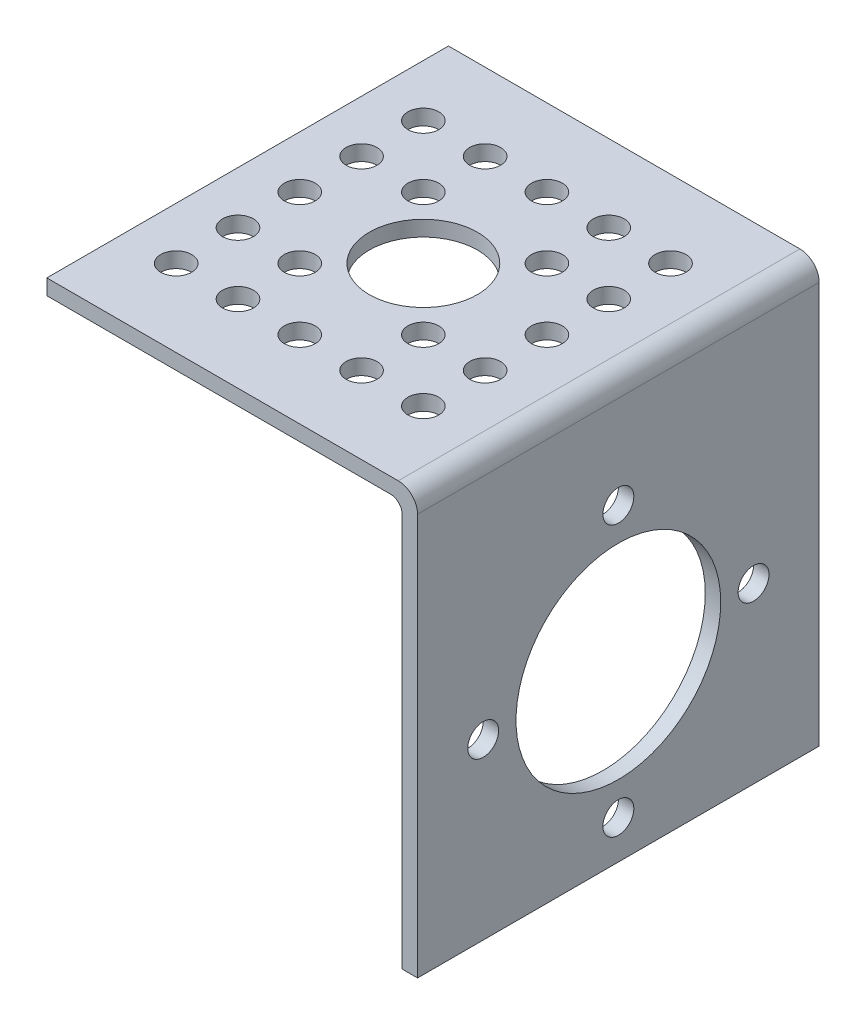
ISO-10303-21;
HEADER;
FILE_DESCRIPTION(('STEP AP214'),'2;1');
FILE_NAME('part.step','',(''),(''),'','','');
FILE_SCHEMA(('AUTOMOTIVE_DESIGN { 1 0 10303 214 1 1 1 1 }'));
ENDSEC;
DATA;
#1=APPLICATION_CONTEXT('core data for automotive mechanical design processes');
#2=APPLICATION_PROTOCOL_DEFINITION('international standard','automotive_design',2000,#1);
#3=PRODUCT_CONTEXT('',#1,'mechanical');
#4=PRODUCT('Part','Part','',(#3));
#5=PRODUCT_RELATED_PRODUCT_CATEGORY('part','',(#4));
#6=PRODUCT_DEFINITION_FORMATION('','',#4);
#7=PRODUCT_DEFINITION_CONTEXT('part definition',#1,'design');
#8=PRODUCT_DEFINITION('design','',#6,#7);
#9=PRODUCT_DEFINITION_SHAPE('','',#8);
#10=(LENGTH_UNIT() NAMED_UNIT(*) SI_UNIT(.MILLI.,.METRE.));
#11=(NAMED_UNIT(*) PLANE_ANGLE_UNIT() SI_UNIT($,.RADIAN.));
#12=(NAMED_UNIT(*) SI_UNIT($,.STERADIAN.) SOLID_ANGLE_UNIT());
#13=UNCERTAINTY_MEASURE_WITH_UNIT(LENGTH_MEASURE(1.E-05),#10,'distance_accuracy_value','');
#14=(GEOMETRIC_REPRESENTATION_CONTEXT(3) GLOBAL_UNCERTAINTY_ASSIGNED_CONTEXT((#13)) GLOBAL_UNIT_ASSIGNED_CONTEXT((#10,
#11,#12)) REPRESENTATION_CONTEXT('',''));
#15=CARTESIAN_POINT('',(0.,0.,0.));
#16=DIRECTION('',(0.,0.,1.));
#17=DIRECTION('',(1.,0.,0.));
#18=AXIS2_PLACEMENT_3D('',#15,#16,#17);
#19=CARTESIAN_POINT('',(2.,0.,0.));
#20=DIRECTION('',(-1.,0.,0.));
#21=DIRECTION('',(0.,0.,1.));
#22=AXIS2_PLACEMENT_3D('',#19,#20,#21);
#23=PLANE('',#22);
#24=DIRECTION('',(0.,1.,0.));
#25=VECTOR('',#24,1.);
#26=CARTESIAN_POINT('',(2.,30.,-26.));
#27=LINE('',#26,#25);
#28=CARTESIAN_POINT('',(2.,-22.5,-26.));
#29=VERTEX_POINT('',#28);
#30=CARTESIAN_POINT('',(2.,29.5,-26.));
#31=VERTEX_POINT('',#30);
#32=EDGE_CURVE('E198',#29,#31,#27,.T.);
#33=ORIENTED_EDGE('',*,*,#32,.T.);
#34=DIRECTION('',(0.,0.,1.));
#35=VECTOR('',#34,1.);
#36=CARTESIAN_POINT('',(2.,29.5,26.));
#37=LINE('',#36,#35);
#38=CARTESIAN_POINT('',(2.,29.5,26.));
#39=VERTEX_POINT('',#38);
#40=EDGE_CURVE('E229',#31,#39,#37,.T.);
#41=ORIENTED_EDGE('',*,*,#40,.T.);
#42=DIRECTION('',(0.,-1.,0.));
#43=VECTOR('',#42,1.);
#44=CARTESIAN_POINT('',(2.,30.,26.));
#45=LINE('',#44,#43);
#46=CARTESIAN_POINT('',(2.,-22.5,26.));
#47=VERTEX_POINT('',#46);
#48=EDGE_CURVE('E191',#39,#47,#45,.T.);
#49=ORIENTED_EDGE('',*,*,#48,.T.);
#50=DIRECTION('',(0.,0.,-1.));
#51=VECTOR('',#50,1.);
#52=CARTESIAN_POINT('',(2.,-22.5,26.));
#53=LINE('',#52,#51);
#54=EDGE_CURVE('E194',#47,#29,#53,.T.);
#55=ORIENTED_EDGE('',*,*,#54,.T.);
#56=EDGE_LOOP('',(#33,#41,#49,#55));
#57=FACE_BOUND('',#56,.T.);
#58=CARTESIAN_POINT('',(2.,17.5,0.));
#59=DIRECTION('',(1.,0.,0.));
#60=DIRECTION('',(0.,0.,-1.));
#61=AXIS2_PLACEMENT_3D('',#58,#59,#60);
#62=CIRCLE('',#61,2.);
#63=CARTESIAN_POINT('',(2.,17.5,-2.));
#64=VERTEX_POINT('',#63);
#65=EDGE_CURVE('E183',#64,#64,#62,.T.);
#66=ORIENTED_EDGE('',*,*,#65,.F.);
#67=EDGE_LOOP('',(#66));
#68=FACE_BOUND('',#67,.T.);
#69=CARTESIAN_POINT('',(2.,0.,0.));
#70=DIRECTION('',(1.,0.,0.));
#71=DIRECTION('',(0.,0.,-1.));
#72=AXIS2_PLACEMENT_3D('',#69,#70,#71);
#73=CIRCLE('',#72,13.25);
#74=CARTESIAN_POINT('',(2.,0.,-13.25));
#75=VERTEX_POINT('',#74);
#76=EDGE_CURVE('E175',#75,#75,#73,.T.);
#77=ORIENTED_EDGE('',*,*,#76,.F.);
#78=EDGE_LOOP('',(#77));
#79=FACE_BOUND('',#78,.T.);
#80=CARTESIAN_POINT('',(2.,0.,-17.5));
#81=DIRECTION('',(1.,0.,0.));
#82=DIRECTION('',(0.,0.,-1.));
#83=AXIS2_PLACEMENT_3D('',#80,#81,#82);
#84=CIRCLE('',#83,2.);
#85=CARTESIAN_POINT('',(2.,0.,-19.5));
#86=VERTEX_POINT('',#85);
#87=EDGE_CURVE('E167',#86,#86,#84,.T.);
#88=ORIENTED_EDGE('',*,*,#87,.F.);
#89=EDGE_LOOP('',(#88));
#90=FACE_BOUND('',#89,.T.);
#91=CARTESIAN_POINT('',(2.,-17.5,1.2220184685951E-13));
#92=DIRECTION('',(1.,0.,0.));
#93=DIRECTION('',(0.,0.,-1.));
#94=AXIS2_PLACEMENT_3D('',#91,#92,#93);
#95=CIRCLE('',#94,2.);
#96=CARTESIAN_POINT('',(2.,-17.5,-1.99999999999988));
#97=VERTEX_POINT('',#96);
#98=EDGE_CURVE('E159',#97,#97,#95,.T.);
#99=ORIENTED_EDGE('',*,*,#98,.F.);
#100=EDGE_LOOP('',(#99));
#101=FACE_BOUND('',#100,.T.);
#102=CARTESIAN_POINT('',(2.,1.83302770289264E-13,17.5));
#103=DIRECTION('',(1.,0.,0.));
#104=DIRECTION('',(0.,0.,-1.));
#105=AXIS2_PLACEMENT_3D('',#102,#103,#104);
#106=CIRCLE('',#105,2.);
#107=CARTESIAN_POINT('',(2.,1.83302770289264E-13,15.5));
#108=VERTEX_POINT('',#107);
#109=EDGE_CURVE('E151',#108,#108,#106,.T.);
#110=ORIENTED_EDGE('',*,*,#109,.F.);
#111=EDGE_LOOP('',(#110));
#112=FACE_BOUND('',#111,.T.);
#113=ADVANCED_FACE('F38',(#57,#68,#79,#90,#101,#112),#23,.F.);
#114=CARTESIAN_POINT('',(0.,0.,0.));
#115=DIRECTION('',(-1.,0.,0.));
#116=DIRECTION('',(0.,0.,1.));
#117=AXIS2_PLACEMENT_3D('',#114,#115,#116);
#118=PLANE('',#117);
#119=CARTESIAN_POINT('',(0.,-17.5,1.2220184685951E-13));
#120=DIRECTION('',(1.,0.,0.));
#121=DIRECTION('',(0.,0.,-1.));
#122=AXIS2_PLACEMENT_3D('',#119,#120,#121);
#123=CIRCLE('',#122,2.);
#124=CARTESIAN_POINT('',(0.,-17.5,-1.99999999999988));
#125=VERTEX_POINT('',#124);
#126=EDGE_CURVE('E155',#125,#125,#123,.T.);
#127=ORIENTED_EDGE('',*,*,#126,.T.);
#128=EDGE_LOOP('',(#127));
#129=FACE_BOUND('',#128,.T.);
#130=CARTESIAN_POINT('',(0.,0.,0.));
#131=DIRECTION('',(1.,0.,0.));
#132=DIRECTION('',(0.,0.,-1.));
#133=AXIS2_PLACEMENT_3D('',#130,#131,#132);
#134=CIRCLE('',#133,13.25);
#135=CARTESIAN_POINT('',(0.,0.,-13.25));
#136=VERTEX_POINT('',#135);
#137=EDGE_CURVE('E171',#136,#136,#134,.T.);
#138=ORIENTED_EDGE('',*,*,#137,.T.);
#139=EDGE_LOOP('',(#138));
#140=FACE_BOUND('',#139,.T.);
#141=DIRECTION('',(0.,-1.,0.));
#142=VECTOR('',#141,1.);
#143=CARTESIAN_POINT('',(0.,30.,26.));
#144=LINE('',#143,#142);
#145=CARTESIAN_POINT('',(0.,28.5,26.));
#146=VERTEX_POINT('',#145);
#147=CARTESIAN_POINT('',(0.,-22.5,26.));
#148=VERTEX_POINT('',#147);
#149=EDGE_CURVE('E187',#146,#148,#144,.T.);
#150=ORIENTED_EDGE('',*,*,#149,.F.);
#151=DIRECTION('',(0.,0.,1.));
#152=VECTOR('',#151,1.);
#153=CARTESIAN_POINT('',(0.,28.5,-26.));
#154=LINE('',#153,#152);
#155=CARTESIAN_POINT('',(0.,28.5,-26.));
#156=VERTEX_POINT('',#155);
#157=EDGE_CURVE('E220',#146,#156,#154,.F.);
#158=ORIENTED_EDGE('',*,*,#157,.T.);
#159=DIRECTION('',(0.,1.,0.));
#160=VECTOR('',#159,1.);
#161=CARTESIAN_POINT('',(0.,30.,-26.));
#162=LINE('',#161,#160);
#163=CARTESIAN_POINT('',(0.,-22.5,-26.));
#164=VERTEX_POINT('',#163);
#165=EDGE_CURVE('E195',#164,#156,#162,.T.);
#166=ORIENTED_EDGE('',*,*,#165,.F.);
#167=DIRECTION('',(0.,0.,-1.));
#168=VECTOR('',#167,1.);
#169=CARTESIAN_POINT('',(0.,-22.5,26.));
#170=LINE('',#169,#168);
#171=EDGE_CURVE('E205',#148,#164,#170,.T.);
#172=ORIENTED_EDGE('',*,*,#171,.F.);
#173=EDGE_LOOP('',(#150,#158,#166,#172));
#174=FACE_BOUND('',#173,.T.);
#175=CARTESIAN_POINT('',(0.,17.5,0.));
#176=DIRECTION('',(1.,0.,0.));
#177=DIRECTION('',(0.,0.,-1.));
#178=AXIS2_PLACEMENT_3D('',#175,#176,#177);
#179=CIRCLE('',#178,2.);
#180=CARTESIAN_POINT('',(0.,17.5,-2.));
#181=VERTEX_POINT('',#180);
#182=EDGE_CURVE('E179',#181,#181,#179,.T.);
#183=ORIENTED_EDGE('',*,*,#182,.T.);
#184=EDGE_LOOP('',(#183));
#185=FACE_BOUND('',#184,.T.);
#186=CARTESIAN_POINT('',(0.,0.,-17.5));
#187=DIRECTION('',(1.,0.,0.));
#188=DIRECTION('',(0.,0.,-1.));
#189=AXIS2_PLACEMENT_3D('',#186,#187,#188);
#190=CIRCLE('',#189,2.);
#191=CARTESIAN_POINT('',(0.,0.,-19.5));
#192=VERTEX_POINT('',#191);
#193=EDGE_CURVE('E163',#192,#192,#190,.T.);
#194=ORIENTED_EDGE('',*,*,#193,.T.);
#195=EDGE_LOOP('',(#194));
#196=FACE_BOUND('',#195,.T.);
#197=CARTESIAN_POINT('',(0.,1.83302770289264E-13,17.5));
#198=DIRECTION('',(1.,0.,0.));
#199=DIRECTION('',(0.,0.,-1.));
#200=AXIS2_PLACEMENT_3D('',#197,#198,#199);
#201=CIRCLE('',#200,2.);
#202=CARTESIAN_POINT('',(0.,1.83302770289264E-13,15.5));
#203=VERTEX_POINT('',#202);
#204=EDGE_CURVE('E145',#203,#203,#201,.T.);
#205=ORIENTED_EDGE('',*,*,#204,.T.);
#206=EDGE_LOOP('',(#205));
#207=FACE_BOUND('',#206,.T.);
#208=ADVANCED_FACE('F515',(#129,#140,#174,#185,#196,#207),#118,.T.);
#209=CARTESIAN_POINT('',(2.,30.,26.));
#210=DIRECTION('',(0.,0.,-1.));
#211=DIRECTION('',(0.,1.,0.));
#212=AXIS2_PLACEMENT_3D('',#209,#210,#211);
#213=PLANE('',#212);
#214=ORIENTED_EDGE('',*,*,#48,.F.);
#215=CARTESIAN_POINT('',(-0.5,29.5,26.));
#216=DIRECTION('',(0.,0.,-1.));
#217=DIRECTION('',(0.,1.,0.));
#218=AXIS2_PLACEMENT_3D('',#215,#216,#217);
#219=CIRCLE('',#218,2.5);
#220=CARTESIAN_POINT('',(-0.5,32.,26.));
#221=VERTEX_POINT('',#220);
#222=EDGE_CURVE('E63',#39,#221,#219,.F.);
#223=ORIENTED_EDGE('',*,*,#222,.T.);
#224=DIRECTION('',(1.,0.,0.));
#225=VECTOR('',#224,1.);
#226=CARTESIAN_POINT('',(-46.,32.,26.));
#227=LINE('',#226,#225);
#228=CARTESIAN_POINT('',(-46.,32.,26.));
#229=VERTEX_POINT('',#228);
#230=EDGE_CURVE('E129',#229,#221,#227,.T.);
#231=ORIENTED_EDGE('',*,*,#230,.F.);
#232=DIRECTION('',(0.,-1.,0.));
#233=VECTOR('',#232,1.);
#234=CARTESIAN_POINT('',(-46.,32.,26.));
#235=LINE('',#234,#233);
#236=CARTESIAN_POINT('',(-46.,30.,26.));
#237=VERTEX_POINT('',#236);
#238=EDGE_CURVE('E122',#229,#237,#235,.T.);
#239=ORIENTED_EDGE('',*,*,#238,.T.);
#240=DIRECTION('',(1.,0.,0.));
#241=VECTOR('',#240,1.);
#242=CARTESIAN_POINT('',(-46.,30.,26.));
#243=LINE('',#242,#241);
#244=CARTESIAN_POINT('',(-1.5,30.,26.));
#245=VERTEX_POINT('',#244);
#246=EDGE_CURVE('E105',#237,#245,#243,.T.);
#247=ORIENTED_EDGE('',*,*,#246,.T.);
#248=CARTESIAN_POINT('',(-1.5,28.5,26.));
#249=DIRECTION('',(0.,0.,-1.));
#250=DIRECTION('',(0.,1.,0.));
#251=AXIS2_PLACEMENT_3D('',#248,#249,#250);
#252=CIRCLE('',#251,1.5);
#253=EDGE_CURVE('E223',#245,#146,#252,.T.);
#254=ORIENTED_EDGE('',*,*,#253,.T.);
#255=ORIENTED_EDGE('',*,*,#149,.T.);
#256=DIRECTION('',(-1.,0.,0.));
#257=VECTOR('',#256,1.);
#258=CARTESIAN_POINT('',(2.,-22.5,26.));
#259=LINE('',#258,#257);
#260=EDGE_CURVE('E214',#47,#148,#259,.T.);
#261=ORIENTED_EDGE('',*,*,#260,.F.);
#262=EDGE_LOOP('',(#214,#223,#231,#239,#247,#254,#255,#261));
#263=FACE_BOUND('',#262,.T.);
#264=ADVANCED_FACE('F128',(#263),#213,.F.);
#265=CARTESIAN_POINT('',(2.,-22.5,26.));
#266=DIRECTION('',(0.,1.,0.));
#267=DIRECTION('',(0.,0.,1.));
#268=AXIS2_PLACEMENT_3D('',#265,#266,#267);
#269=PLANE('',#268);
#270=ORIENTED_EDGE('',*,*,#171,.T.);
#271=DIRECTION('',(-1.,0.,0.));
#272=VECTOR('',#271,1.);
#273=CARTESIAN_POINT('',(2.,-22.5,-26.));
#274=LINE('',#273,#272);
#275=EDGE_CURVE('E202',#29,#164,#274,.T.);
#276=ORIENTED_EDGE('',*,*,#275,.F.);
#277=ORIENTED_EDGE('',*,*,#54,.F.);
#278=ORIENTED_EDGE('',*,*,#260,.T.);
#279=EDGE_LOOP('',(#270,#276,#277,#278));
#280=FACE_BOUND('',#279,.T.);
#281=ADVANCED_FACE('F509',(#280),#269,.F.);
#282=CARTESIAN_POINT('',(2.,30.,-26.));
#283=DIRECTION('',(0.,0.,1.));
#284=DIRECTION('',(0.,-1.,0.));
#285=AXIS2_PLACEMENT_3D('',#282,#283,#284);
#286=PLANE('',#285);
#287=DIRECTION('',(1.,0.,0.));
#288=VECTOR('',#287,1.);
#289=CARTESIAN_POINT('',(-46.,32.,-26.));
#290=LINE('',#289,#288);
#291=CARTESIAN_POINT('',(-46.,32.,-26.));
#292=VERTEX_POINT('',#291);
#293=CARTESIAN_POINT('',(-0.5,32.,-26.));
#294=VERTEX_POINT('',#293);
#295=EDGE_CURVE('E146',#292,#294,#290,.T.);
#296=ORIENTED_EDGE('',*,*,#295,.T.);
#297=CARTESIAN_POINT('',(-0.5,29.5,-26.));
#298=DIRECTION('',(0.,0.,1.));
#299=DIRECTION('',(0.,-1.,0.));
#300=AXIS2_PLACEMENT_3D('',#297,#298,#299);
#301=CIRCLE('',#300,2.5);
#302=EDGE_CURVE('E11',#294,#31,#301,.F.);
#303=ORIENTED_EDGE('',*,*,#302,.T.);
#304=ORIENTED_EDGE('',*,*,#32,.F.);
#305=ORIENTED_EDGE('',*,*,#275,.T.);
#306=ORIENTED_EDGE('',*,*,#165,.T.);
#307=CARTESIAN_POINT('',(-1.5,28.5,-26.));
#308=DIRECTION('',(0.,0.,1.));
#309=DIRECTION('',(0.,-1.,0.));
#310=AXIS2_PLACEMENT_3D('',#307,#308,#309);
#311=CIRCLE('',#310,1.5);
#312=CARTESIAN_POINT('',(-1.5,30.,-26.));
#313=VERTEX_POINT('',#312);
#314=EDGE_CURVE('E226',#156,#313,#311,.T.);
#315=ORIENTED_EDGE('',*,*,#314,.T.);
#316=DIRECTION('',(1.,0.,0.));
#317=VECTOR('',#316,1.);
#318=CARTESIAN_POINT('',(-46.,30.,-26.));
#319=LINE('',#318,#317);
#320=CARTESIAN_POINT('',(-46.,30.,-26.));
#321=VERTEX_POINT('',#320);
#322=EDGE_CURVE('E114',#321,#313,#319,.T.);
#323=ORIENTED_EDGE('',*,*,#322,.F.);
#324=DIRECTION('',(0.,1.,0.));
#325=VECTOR('',#324,1.);
#326=CARTESIAN_POINT('',(-46.,30.,-26.));
#327=LINE('',#326,#325);
#328=EDGE_CURVE('E125',#321,#292,#327,.T.);
#329=ORIENTED_EDGE('',*,*,#328,.T.);
#330=EDGE_LOOP('',(#296,#303,#304,#305,#306,#315,#323,#329));
#331=FACE_BOUND('',#330,.T.);
#332=ADVANCED_FACE('F502',(#331),#286,.F.);
#333=CARTESIAN_POINT('',(2.,17.5,0.));
#334=DIRECTION('',(-1.,0.,0.));
#335=DIRECTION('',(0.,0.,1.));
#336=AXIS2_PLACEMENT_3D('',#333,#334,#335);
#337=CYLINDRICAL_SURFACE('',#336,2.);
#338=ORIENTED_EDGE('',*,*,#65,.T.);
#339=EDGE_LOOP('',(#338));
#340=FACE_BOUND('',#339,.T.);
#341=ORIENTED_EDGE('',*,*,#182,.F.);
#342=EDGE_LOOP('',(#341));
#343=FACE_BOUND('',#342,.T.);
#344=ADVANCED_FACE('F535',(#340,#343),#337,.F.);
#345=CARTESIAN_POINT('',(2.,0.,0.));
#346=DIRECTION('',(-1.,0.,0.));
#347=DIRECTION('',(0.,0.,1.));
#348=AXIS2_PLACEMENT_3D('',#345,#346,#347);
#349=CYLINDRICAL_SURFACE('',#348,13.25);
#350=ORIENTED_EDGE('',*,*,#76,.T.);
#351=EDGE_LOOP('',(#350));
#352=FACE_BOUND('',#351,.T.);
#353=ORIENTED_EDGE('',*,*,#137,.F.);
#354=EDGE_LOOP('',(#353));
#355=FACE_BOUND('',#354,.T.);
#356=ADVANCED_FACE('F561',(#352,#355),#349,.F.);
#357=CARTESIAN_POINT('',(2.,0.,-17.5));
#358=DIRECTION('',(-1.,0.,0.));
#359=DIRECTION('',(0.,0.,1.));
#360=AXIS2_PLACEMENT_3D('',#357,#358,#359);
#361=CYLINDRICAL_SURFACE('',#360,2.);
#362=ORIENTED_EDGE('',*,*,#87,.T.);
#363=EDGE_LOOP('',(#362));
#364=FACE_BOUND('',#363,.T.);
#365=ORIENTED_EDGE('',*,*,#193,.F.);
#366=EDGE_LOOP('',(#365));
#367=FACE_BOUND('',#366,.T.);
#368=ADVANCED_FACE('F568',(#364,#367),#361,.F.);
#369=CARTESIAN_POINT('',(2.,-17.5,1.2220184685951E-13));
#370=DIRECTION('',(-1.,0.,0.));
#371=DIRECTION('',(0.,0.,1.));
#372=AXIS2_PLACEMENT_3D('',#369,#370,#371);
#373=CYLINDRICAL_SURFACE('',#372,2.);
#374=ORIENTED_EDGE('',*,*,#98,.T.);
#375=EDGE_LOOP('',(#374));
#376=FACE_BOUND('',#375,.T.);
#377=ORIENTED_EDGE('',*,*,#126,.F.);
#378=EDGE_LOOP('',(#377));
#379=FACE_BOUND('',#378,.T.);
#380=ADVANCED_FACE('F575',(#376,#379),#373,.F.);
#381=CARTESIAN_POINT('',(2.,1.83302770289264E-13,17.5));
#382=DIRECTION('',(-1.,0.,0.));
#383=DIRECTION('',(0.,0.,1.));
#384=AXIS2_PLACEMENT_3D('',#381,#382,#383);
#385=CYLINDRICAL_SURFACE('',#384,2.);
#386=ORIENTED_EDGE('',*,*,#109,.T.);
#387=EDGE_LOOP('',(#386));
#388=FACE_BOUND('',#387,.T.);
#389=ORIENTED_EDGE('',*,*,#204,.F.);
#390=EDGE_LOOP('',(#389));
#391=FACE_BOUND('',#390,.T.);
#392=ADVANCED_FACE('F462',(#388,#391),#385,.F.);
#393=CARTESIAN_POINT('',(-46.,32.,-26.));
#394=DIRECTION('',(0.,1.,0.));
#395=DIRECTION('',(0.,0.,1.));
#396=AXIS2_PLACEMENT_3D('',#393,#394,#395);
#397=PLANE('',#396);
#398=CARTESIAN_POINT('',(-7.25,32.,-16.));
#399=DIRECTION('',(0.,1.,0.));
#400=DIRECTION('',(0.,0.,1.));
#401=AXIS2_PLACEMENT_3D('',#398,#399,#400);
#402=CIRCLE('',#401,2.);
#403=CARTESIAN_POINT('',(-7.25,32.,-14.));
#404=VERTEX_POINT('',#403);
#405=EDGE_CURVE('E393',#404,#404,#402,.T.);
#406=ORIENTED_EDGE('',*,*,#405,.F.);
#407=EDGE_LOOP('',(#406));
#408=FACE_BOUND('',#407,.T.);
#409=CARTESIAN_POINT('',(-31.2499999999999,32.,-8.));
#410=DIRECTION('',(0.,1.,0.));
#411=DIRECTION('',(0.,0.,1.));
#412=AXIS2_PLACEMENT_3D('',#409,#410,#411);
#413=CIRCLE('',#412,2.);
#414=CARTESIAN_POINT('',(-31.2499999999999,32.,-5.99999999999999));
#415=VERTEX_POINT('',#414);
#416=EDGE_CURVE('E383',#415,#415,#413,.T.);
#417=ORIENTED_EDGE('',*,*,#416,.F.);
#418=EDGE_LOOP('',(#417));
#419=FACE_BOUND('',#418,.T.);
#420=CARTESIAN_POINT('',(-15.2499999999999,32.,-8.));
#421=DIRECTION('',(0.,1.,0.));
#422=DIRECTION('',(0.,0.,1.));
#423=AXIS2_PLACEMENT_3D('',#420,#421,#422);
#424=CIRCLE('',#423,2.);
#425=CARTESIAN_POINT('',(-15.2499999999999,32.,-5.99999999999999));
#426=VERTEX_POINT('',#425);
#427=EDGE_CURVE('E446',#426,#426,#424,.T.);
#428=ORIENTED_EDGE('',*,*,#427,.F.);
#429=EDGE_LOOP('',(#428));
#430=FACE_BOUND('',#429,.T.);
#431=CARTESIAN_POINT('',(-7.24999999999992,32.,-8.));
#432=DIRECTION('',(0.,1.,0.));
#433=DIRECTION('',(0.,0.,1.));
#434=AXIS2_PLACEMENT_3D('',#431,#432,#433);
#435=CIRCLE('',#434,2.);
#436=CARTESIAN_POINT('',(-7.24999999999992,32.,-5.99999999999999));
#437=VERTEX_POINT('',#436);
#438=EDGE_CURVE('E408',#437,#437,#435,.T.);
#439=ORIENTED_EDGE('',*,*,#438,.F.);
#440=EDGE_LOOP('',(#439));
#441=FACE_BOUND('',#440,.T.);
#442=CARTESIAN_POINT('',(-15.25,32.,-16.));
#443=DIRECTION('',(0.,1.,0.));
#444=DIRECTION('',(0.,0.,1.));
#445=AXIS2_PLACEMENT_3D('',#442,#443,#444);
#446=CIRCLE('',#445,2.);
#447=CARTESIAN_POINT('',(-15.25,32.,-14.));
#448=VERTEX_POINT('',#447);
#449=EDGE_CURVE('E389',#448,#448,#446,.T.);
#450=ORIENTED_EDGE('',*,*,#449,.F.);
#451=EDGE_LOOP('',(#450));
#452=FACE_BOUND('',#451,.T.);
#453=CARTESIAN_POINT('',(-23.25,32.,-16.));
#454=DIRECTION('',(0.,1.,0.));
#455=DIRECTION('',(0.,0.,1.));
#456=AXIS2_PLACEMENT_3D('',#453,#454,#455);
#457=CIRCLE('',#456,2.);
#458=CARTESIAN_POINT('',(-23.25,32.,-14.));
#459=VERTEX_POINT('',#458);
#460=EDGE_CURVE('E380',#459,#459,#457,.T.);
#461=ORIENTED_EDGE('',*,*,#460,.F.);
#462=EDGE_LOOP('',(#461));
#463=FACE_BOUND('',#462,.T.);
#464=CARTESIAN_POINT('',(-31.25,32.,-16.));
#465=DIRECTION('',(0.,1.,0.));
#466=DIRECTION('',(0.,0.,1.));
#467=AXIS2_PLACEMENT_3D('',#464,#465,#466);
#468=CIRCLE('',#467,2.);
#469=CARTESIAN_POINT('',(-31.25,32.,-14.));
#470=VERTEX_POINT('',#469);
#471=EDGE_CURVE('E374',#470,#470,#468,.T.);
#472=ORIENTED_EDGE('',*,*,#471,.F.);
#473=EDGE_LOOP('',(#472));
#474=FACE_BOUND('',#473,.T.);
#475=CARTESIAN_POINT('',(-39.25,32.,-16.));
#476=DIRECTION('',(0.,1.,0.));
#477=DIRECTION('',(0.,0.,1.));
#478=AXIS2_PLACEMENT_3D('',#475,#476,#477);
#479=CIRCLE('',#478,2.);
#480=CARTESIAN_POINT('',(-39.25,32.,-14.));
#481=VERTEX_POINT('',#480);
#482=EDGE_CURVE('E371',#481,#481,#479,.T.);
#483=ORIENTED_EDGE('',*,*,#482,.F.);
#484=EDGE_LOOP('',(#483));
#485=FACE_BOUND('',#484,.T.);
#486=CARTESIAN_POINT('',(-7.24999999999975,32.,8.));
#487=DIRECTION('',(0.,1.,0.));
#488=DIRECTION('',(0.,0.,1.));
#489=AXIS2_PLACEMENT_3D('',#486,#487,#488);
#490=CIRCLE('',#489,2.);
#491=CARTESIAN_POINT('',(-7.24999999999975,32.,10.));
#492=VERTEX_POINT('',#491);
#493=EDGE_CURVE('E399',#492,#492,#490,.T.);
#494=ORIENTED_EDGE('',*,*,#493,.F.);
#495=EDGE_LOOP('',(#494));
#496=FACE_BOUND('',#495,.T.);
#497=CARTESIAN_POINT('',(-15.2499999999997,32.,8.));
#498=DIRECTION('',(0.,1.,0.));
#499=DIRECTION('',(0.,0.,1.));
#500=AXIS2_PLACEMENT_3D('',#497,#498,#499);
#501=CIRCLE('',#500,2.);
#502=CARTESIAN_POINT('',(-15.2499999999997,32.,10.));
#503=VERTEX_POINT('',#502);
#504=EDGE_CURVE('E394',#503,#503,#501,.T.);
#505=ORIENTED_EDGE('',*,*,#504,.F.);
#506=EDGE_LOOP('',(#505));
#507=FACE_BOUND('',#506,.T.);
#508=CARTESIAN_POINT('',(-31.2499999999998,32.,8.));
#509=DIRECTION('',(0.,1.,0.));
#510=DIRECTION('',(0.,0.,1.));
#511=AXIS2_PLACEMENT_3D('',#508,#509,#510);
#512=CIRCLE('',#511,2.);
#513=CARTESIAN_POINT('',(-31.2499999999998,32.,10.));
#514=VERTEX_POINT('',#513);
#515=EDGE_CURVE('E398',#514,#514,#512,.T.);
#516=ORIENTED_EDGE('',*,*,#515,.F.);
#517=EDGE_LOOP('',(#516));
#518=FACE_BOUND('',#517,.T.);
#519=CARTESIAN_POINT('',(-7.24999999999983,32.,0.));
#520=DIRECTION('',(0.,1.,0.));
#521=DIRECTION('',(0.,0.,1.));
#522=AXIS2_PLACEMENT_3D('',#519,#520,#521);
#523=CIRCLE('',#522,2.);
#524=CARTESIAN_POINT('',(-7.24999999999983,32.,2.00000000000001));
#525=VERTEX_POINT('',#524);
#526=EDGE_CURVE('E404',#525,#525,#523,.T.);
#527=ORIENTED_EDGE('',*,*,#526,.F.);
#528=EDGE_LOOP('',(#527));
#529=FACE_BOUND('',#528,.T.);
#530=CARTESIAN_POINT('',(-31.2499999999997,32.,16.));
#531=DIRECTION('',(0.,1.,0.));
#532=DIRECTION('',(0.,0.,1.));
#533=AXIS2_PLACEMENT_3D('',#530,#531,#532);
#534=CIRCLE('',#533,2.);
#535=CARTESIAN_POINT('',(-31.2499999999997,32.,18.));
#536=VERTEX_POINT('',#535);
#537=EDGE_CURVE('E403',#536,#536,#534,.T.);
#538=ORIENTED_EDGE('',*,*,#537,.F.);
#539=EDGE_LOOP('',(#538));
#540=FACE_BOUND('',#539,.T.);
#541=CARTESIAN_POINT('',(-23.2499999999997,32.,16.));
#542=DIRECTION('',(0.,1.,0.));
#543=DIRECTION('',(0.,0.,1.));
#544=AXIS2_PLACEMENT_3D('',#541,#542,#543);
#545=CIRCLE('',#544,2.);
#546=CARTESIAN_POINT('',(-23.2499999999997,32.,18.));
#547=VERTEX_POINT('',#546);
#548=EDGE_CURVE('E415',#547,#547,#545,.T.);
#549=ORIENTED_EDGE('',*,*,#548,.F.);
#550=EDGE_LOOP('',(#549));
#551=FACE_BOUND('',#550,.T.);
#552=CARTESIAN_POINT('',(-15.2499999999997,32.,16.));
#553=DIRECTION('',(0.,1.,0.));
#554=DIRECTION('',(0.,0.,1.));
#555=AXIS2_PLACEMENT_3D('',#552,#553,#554);
#556=CIRCLE('',#555,2.);
#557=CARTESIAN_POINT('',(-15.2499999999997,32.,18.));
#558=VERTEX_POINT('',#557);
#559=EDGE_CURVE('E419',#558,#558,#556,.T.);
#560=ORIENTED_EDGE('',*,*,#559,.F.);
#561=EDGE_LOOP('',(#560));
#562=FACE_BOUND('',#561,.T.);
#563=CARTESIAN_POINT('',(-7.24999999999967,32.,16.));
#564=DIRECTION('',(0.,1.,0.));
#565=DIRECTION('',(0.,0.,1.));
#566=AXIS2_PLACEMENT_3D('',#563,#564,#565);
#567=CIRCLE('',#566,2.);
#568=CARTESIAN_POINT('',(-7.24999999999967,32.,18.));
#569=VERTEX_POINT('',#568);
#570=EDGE_CURVE('E422',#569,#569,#567,.T.);
#571=ORIENTED_EDGE('',*,*,#570,.F.);
#572=EDGE_LOOP('',(#571));
#573=FACE_BOUND('',#572,.T.);
#574=CARTESIAN_POINT('',(-39.2499999999999,32.,-8.));
#575=DIRECTION('',(0.,1.,0.));
#576=DIRECTION('',(0.,0.,1.));
#577=AXIS2_PLACEMENT_3D('',#574,#575,#576);
#578=CIRCLE('',#577,2.);
#579=CARTESIAN_POINT('',(-39.2499999999999,32.,-5.99999999999999));
#580=VERTEX_POINT('',#579);
#581=EDGE_CURVE('E425',#580,#580,#578,.T.);
#582=ORIENTED_EDGE('',*,*,#581,.F.);
#583=EDGE_LOOP('',(#582));
#584=FACE_BOUND('',#583,.T.);
#585=CARTESIAN_POINT('',(-39.2499999999998,32.,0.));
#586=DIRECTION('',(0.,1.,0.));
#587=DIRECTION('',(0.,0.,1.));
#588=AXIS2_PLACEMENT_3D('',#585,#586,#587);
#589=CIRCLE('',#588,2.);
#590=CARTESIAN_POINT('',(-39.2499999999998,32.,2.00000000000001));
#591=VERTEX_POINT('',#590);
#592=EDGE_CURVE('E430',#591,#591,#589,.T.);
#593=ORIENTED_EDGE('',*,*,#592,.F.);
#594=EDGE_LOOP('',(#593));
#595=FACE_BOUND('',#594,.T.);
#596=CARTESIAN_POINT('',(-39.2499999999998,32.,8.));
#597=DIRECTION('',(0.,1.,0.));
#598=DIRECTION('',(0.,0.,1.));
#599=AXIS2_PLACEMENT_3D('',#596,#597,#598);
#600=CIRCLE('',#599,2.);
#601=CARTESIAN_POINT('',(-39.2499999999998,32.,10.));
#602=VERTEX_POINT('',#601);
#603=EDGE_CURVE('E436',#602,#602,#600,.T.);
#604=ORIENTED_EDGE('',*,*,#603,.F.);
#605=EDGE_LOOP('',(#604));
#606=FACE_BOUND('',#605,.T.);
#607=CARTESIAN_POINT('',(-39.2499999999997,32.,16.));
#608=DIRECTION('',(0.,1.,0.));
#609=DIRECTION('',(0.,0.,1.));
#610=AXIS2_PLACEMENT_3D('',#607,#608,#609);
#611=CIRCLE('',#610,2.);
#612=CARTESIAN_POINT('',(-39.2499999999997,32.,18.));
#613=VERTEX_POINT('',#612);
#614=EDGE_CURVE('E442',#613,#613,#611,.T.);
#615=ORIENTED_EDGE('',*,*,#614,.F.);
#616=EDGE_LOOP('',(#615));
#617=FACE_BOUND('',#616,.T.);
#618=CARTESIAN_POINT('',(-23.25,32.,0.));
#619=DIRECTION('',(0.,1.,0.));
#620=DIRECTION('',(0.,0.,1.));
#621=AXIS2_PLACEMENT_3D('',#618,#619,#620);
#622=CIRCLE('',#621,7.);
#623=CARTESIAN_POINT('',(-23.25,32.,7.));
#624=VERTEX_POINT('',#623);
#625=EDGE_CURVE('E136',#624,#624,#622,.T.);
#626=ORIENTED_EDGE('',*,*,#625,.F.);
#627=EDGE_LOOP('',(#626));
#628=FACE_BOUND('',#627,.T.);
#629=ORIENTED_EDGE('',*,*,#230,.T.);
#630=DIRECTION('',(0.,0.,1.));
#631=VECTOR('',#630,1.);
#632=CARTESIAN_POINT('',(-0.5,32.,-26.));
#633=LINE('',#632,#631);
#634=EDGE_CURVE('E48',#221,#294,#633,.F.);
#635=ORIENTED_EDGE('',*,*,#634,.T.);
#636=ORIENTED_EDGE('',*,*,#295,.F.);
#637=DIRECTION('',(0.,0.,1.));
#638=VECTOR('',#637,1.);
#639=CARTESIAN_POINT('',(-46.,32.,-26.));
#640=LINE('',#639,#638);
#641=EDGE_CURVE('E115',#292,#229,#640,.T.);
#642=ORIENTED_EDGE('',*,*,#641,.T.);
#643=EDGE_LOOP('',(#629,#635,#636,#642));
#644=FACE_BOUND('',#643,.T.);
#645=ADVANCED_FACE('F321',(#408,#419,#430,#441,#452,#463,#474,#485,#496,#507,#518,#529,#540,
#551,#562,#573,#584,#595,#606,#617,#628,#644),#397,.T.);
#646=CARTESIAN_POINT('',(-46.,30.,26.));
#647=DIRECTION('',(0.,-1.,0.));
#648=DIRECTION('',(0.,0.,-1.));
#649=AXIS2_PLACEMENT_3D('',#646,#647,#648);
#650=PLANE('',#649);
#651=CARTESIAN_POINT('',(-7.25,30.,-16.));
#652=DIRECTION('',(0.,-1.,0.));
#653=DIRECTION('',(0.,0.,-1.));
#654=AXIS2_PLACEMENT_3D('',#651,#652,#653);
#655=CIRCLE('',#654,2.);
#656=CARTESIAN_POINT('',(-7.25,30.,-18.));
#657=VERTEX_POINT('',#656);
#658=EDGE_CURVE('E42',#657,#657,#655,.T.);
#659=ORIENTED_EDGE('',*,*,#658,.F.);
#660=EDGE_LOOP('',(#659));
#661=FACE_BOUND('',#660,.T.);
#662=CARTESIAN_POINT('',(-31.2499999999999,30.,-8.));
#663=DIRECTION('',(0.,-1.,0.));
#664=DIRECTION('',(0.,0.,-1.));
#665=AXIS2_PLACEMENT_3D('',#662,#663,#664);
#666=CIRCLE('',#665,2.);
#667=CARTESIAN_POINT('',(-31.2499999999999,30.,-10.));
#668=VERTEX_POINT('',#667);
#669=EDGE_CURVE('E134',#668,#668,#666,.T.);
#670=ORIENTED_EDGE('',*,*,#669,.F.);
#671=EDGE_LOOP('',(#670));
#672=FACE_BOUND('',#671,.T.);
#673=CARTESIAN_POINT('',(-15.2499999999999,30.,-8.));
#674=DIRECTION('',(0.,-1.,0.));
#675=DIRECTION('',(0.,0.,-1.));
#676=AXIS2_PLACEMENT_3D('',#673,#674,#675);
#677=CIRCLE('',#676,2.);
#678=CARTESIAN_POINT('',(-15.2499999999999,30.,-10.));
#679=VERTEX_POINT('',#678);
#680=EDGE_CURVE('E309',#679,#679,#677,.T.);
#681=ORIENTED_EDGE('',*,*,#680,.F.);
#682=EDGE_LOOP('',(#681));
#683=FACE_BOUND('',#682,.T.);
#684=CARTESIAN_POINT('',(-7.24999999999992,30.,-8.));
#685=DIRECTION('',(0.,-1.,0.));
#686=DIRECTION('',(0.,0.,-1.));
#687=AXIS2_PLACEMENT_3D('',#684,#685,#686);
#688=CIRCLE('',#687,2.);
#689=CARTESIAN_POINT('',(-7.24999999999992,30.,-10.));
#690=VERTEX_POINT('',#689);
#691=EDGE_CURVE('E305',#690,#690,#688,.T.);
#692=ORIENTED_EDGE('',*,*,#691,.F.);
#693=EDGE_LOOP('',(#692));
#694=FACE_BOUND('',#693,.T.);
#695=CARTESIAN_POINT('',(-15.25,30.,-16.));
#696=DIRECTION('',(0.,-1.,0.));
#697=DIRECTION('',(0.,0.,-1.));
#698=AXIS2_PLACEMENT_3D('',#695,#696,#697);
#699=CIRCLE('',#698,2.);
#700=CARTESIAN_POINT('',(-15.25,30.,-18.));
#701=VERTEX_POINT('',#700);
#702=EDGE_CURVE('E301',#701,#701,#699,.T.);
#703=ORIENTED_EDGE('',*,*,#702,.F.);
#704=EDGE_LOOP('',(#703));
#705=FACE_BOUND('',#704,.T.);
#706=CARTESIAN_POINT('',(-23.25,30.,-16.));
#707=DIRECTION('',(0.,-1.,0.));
#708=DIRECTION('',(0.,0.,-1.));
#709=AXIS2_PLACEMENT_3D('',#706,#707,#708);
#710=CIRCLE('',#709,2.);
#711=CARTESIAN_POINT('',(-23.25,30.,-18.));
#712=VERTEX_POINT('',#711);
#713=EDGE_CURVE('E297',#712,#712,#710,.T.);
#714=ORIENTED_EDGE('',*,*,#713,.F.);
#715=EDGE_LOOP('',(#714));
#716=FACE_BOUND('',#715,.T.);
#717=CARTESIAN_POINT('',(-31.25,30.,-16.));
#718=DIRECTION('',(0.,-1.,0.));
#719=DIRECTION('',(0.,0.,-1.));
#720=AXIS2_PLACEMENT_3D('',#717,#718,#719);
#721=CIRCLE('',#720,2.);
#722=CARTESIAN_POINT('',(-31.25,30.,-18.));
#723=VERTEX_POINT('',#722);
#724=EDGE_CURVE('E293',#723,#723,#721,.T.);
#725=ORIENTED_EDGE('',*,*,#724,.F.);
#726=EDGE_LOOP('',(#725));
#727=FACE_BOUND('',#726,.T.);
#728=CARTESIAN_POINT('',(-39.25,30.,-16.));
#729=DIRECTION('',(0.,-1.,0.));
#730=DIRECTION('',(0.,0.,-1.));
#731=AXIS2_PLACEMENT_3D('',#728,#729,#730);
#732=CIRCLE('',#731,2.);
#733=CARTESIAN_POINT('',(-39.25,30.,-18.));
#734=VERTEX_POINT('',#733);
#735=EDGE_CURVE('E289',#734,#734,#732,.T.);
#736=ORIENTED_EDGE('',*,*,#735,.F.);
#737=EDGE_LOOP('',(#736));
#738=FACE_BOUND('',#737,.T.);
#739=CARTESIAN_POINT('',(-7.24999999999975,30.,8.));
#740=DIRECTION('',(0.,-1.,0.));
#741=DIRECTION('',(0.,0.,-1.));
#742=AXIS2_PLACEMENT_3D('',#739,#740,#741);
#743=CIRCLE('',#742,2.);
#744=CARTESIAN_POINT('',(-7.24999999999975,30.,6.));
#745=VERTEX_POINT('',#744);
#746=EDGE_CURVE('E285',#745,#745,#743,.T.);
#747=ORIENTED_EDGE('',*,*,#746,.F.);
#748=EDGE_LOOP('',(#747));
#749=FACE_BOUND('',#748,.T.);
#750=CARTESIAN_POINT('',(-15.2499999999997,30.,8.));
#751=DIRECTION('',(0.,-1.,0.));
#752=DIRECTION('',(0.,0.,-1.));
#753=AXIS2_PLACEMENT_3D('',#750,#751,#752);
#754=CIRCLE('',#753,2.);
#755=CARTESIAN_POINT('',(-15.2499999999997,30.,6.));
#756=VERTEX_POINT('',#755);
#757=EDGE_CURVE('E281',#756,#756,#754,.T.);
#758=ORIENTED_EDGE('',*,*,#757,.F.);
#759=EDGE_LOOP('',(#758));
#760=FACE_BOUND('',#759,.T.);
#761=CARTESIAN_POINT('',(-31.2499999999998,30.,8.));
#762=DIRECTION('',(0.,-1.,0.));
#763=DIRECTION('',(0.,0.,-1.));
#764=AXIS2_PLACEMENT_3D('',#761,#762,#763);
#765=CIRCLE('',#764,2.);
#766=CARTESIAN_POINT('',(-31.2499999999998,30.,6.));
#767=VERTEX_POINT('',#766);
#768=EDGE_CURVE('E277',#767,#767,#765,.T.);
#769=ORIENTED_EDGE('',*,*,#768,.F.);
#770=EDGE_LOOP('',(#769));
#771=FACE_BOUND('',#770,.T.);
#772=CARTESIAN_POINT('',(-7.24999999999983,30.,0.));
#773=DIRECTION('',(0.,-1.,0.));
#774=DIRECTION('',(0.,0.,-1.));
#775=AXIS2_PLACEMENT_3D('',#772,#773,#774);
#776=CIRCLE('',#775,2.);
#777=CARTESIAN_POINT('',(-7.24999999999983,30.,-2.));
#778=VERTEX_POINT('',#777);
#779=EDGE_CURVE('E273',#778,#778,#776,.T.);
#780=ORIENTED_EDGE('',*,*,#779,.F.);
#781=EDGE_LOOP('',(#780));
#782=FACE_BOUND('',#781,.T.);
#783=CARTESIAN_POINT('',(-31.2499999999997,30.,16.));
#784=DIRECTION('',(0.,-1.,0.));
#785=DIRECTION('',(0.,0.,-1.));
#786=AXIS2_PLACEMENT_3D('',#783,#784,#785);
#787=CIRCLE('',#786,2.);
#788=CARTESIAN_POINT('',(-31.2499999999997,30.,14.));
#789=VERTEX_POINT('',#788);
#790=EDGE_CURVE('E269',#789,#789,#787,.T.);
#791=ORIENTED_EDGE('',*,*,#790,.F.);
#792=EDGE_LOOP('',(#791));
#793=FACE_BOUND('',#792,.T.);
#794=CARTESIAN_POINT('',(-23.2499999999997,30.,16.));
#795=DIRECTION('',(0.,-1.,0.));
#796=DIRECTION('',(0.,0.,-1.));
#797=AXIS2_PLACEMENT_3D('',#794,#795,#796);
#798=CIRCLE('',#797,2.);
#799=CARTESIAN_POINT('',(-23.2499999999997,30.,14.));
#800=VERTEX_POINT('',#799);
#801=EDGE_CURVE('E265',#800,#800,#798,.T.);
#802=ORIENTED_EDGE('',*,*,#801,.F.);
#803=EDGE_LOOP('',(#802));
#804=FACE_BOUND('',#803,.T.);
#805=CARTESIAN_POINT('',(-15.2499999999997,30.,16.));
#806=DIRECTION('',(0.,-1.,0.));
#807=DIRECTION('',(0.,0.,-1.));
#808=AXIS2_PLACEMENT_3D('',#805,#806,#807);
#809=CIRCLE('',#808,2.);
#810=CARTESIAN_POINT('',(-15.2499999999997,30.,14.));
#811=VERTEX_POINT('',#810);
#812=EDGE_CURVE('E261',#811,#811,#809,.T.);
#813=ORIENTED_EDGE('',*,*,#812,.F.);
#814=EDGE_LOOP('',(#813));
#815=FACE_BOUND('',#814,.T.);
#816=CARTESIAN_POINT('',(-7.24999999999967,30.,16.));
#817=DIRECTION('',(0.,-1.,0.));
#818=DIRECTION('',(0.,0.,-1.));
#819=AXIS2_PLACEMENT_3D('',#816,#817,#818);
#820=CIRCLE('',#819,2.);
#821=CARTESIAN_POINT('',(-7.24999999999967,30.,14.));
#822=VERTEX_POINT('',#821);
#823=EDGE_CURVE('E257',#822,#822,#820,.T.);
#824=ORIENTED_EDGE('',*,*,#823,.F.);
#825=EDGE_LOOP('',(#824));
#826=FACE_BOUND('',#825,.T.);
#827=CARTESIAN_POINT('',(-39.2499999999999,30.,-8.));
#828=DIRECTION('',(0.,-1.,0.));
#829=DIRECTION('',(0.,0.,-1.));
#830=AXIS2_PLACEMENT_3D('',#827,#828,#829);
#831=CIRCLE('',#830,2.);
#832=CARTESIAN_POINT('',(-39.2499999999999,30.,-10.));
#833=VERTEX_POINT('',#832);
#834=EDGE_CURVE('E253',#833,#833,#831,.T.);
#835=ORIENTED_EDGE('',*,*,#834,.F.);
#836=EDGE_LOOP('',(#835));
#837=FACE_BOUND('',#836,.T.);
#838=CARTESIAN_POINT('',(-39.2499999999998,30.,0.));
#839=DIRECTION('',(0.,-1.,0.));
#840=DIRECTION('',(0.,0.,-1.));
#841=AXIS2_PLACEMENT_3D('',#838,#839,#840);
#842=CIRCLE('',#841,2.);
#843=CARTESIAN_POINT('',(-39.2499999999998,30.,-2.));
#844=VERTEX_POINT('',#843);
#845=EDGE_CURVE('E249',#844,#844,#842,.T.);
#846=ORIENTED_EDGE('',*,*,#845,.F.);
#847=EDGE_LOOP('',(#846));
#848=FACE_BOUND('',#847,.T.);
#849=CARTESIAN_POINT('',(-39.2499999999998,30.,8.));
#850=DIRECTION('',(0.,-1.,0.));
#851=DIRECTION('',(0.,0.,-1.));
#852=AXIS2_PLACEMENT_3D('',#849,#850,#851);
#853=CIRCLE('',#852,2.);
#854=CARTESIAN_POINT('',(-39.2499999999998,30.,6.));
#855=VERTEX_POINT('',#854);
#856=EDGE_CURVE('E245',#855,#855,#853,.T.);
#857=ORIENTED_EDGE('',*,*,#856,.F.);
#858=EDGE_LOOP('',(#857));
#859=FACE_BOUND('',#858,.T.);
#860=CARTESIAN_POINT('',(-39.2499999999997,30.,16.));
#861=DIRECTION('',(0.,-1.,0.));
#862=DIRECTION('',(0.,0.,-1.));
#863=AXIS2_PLACEMENT_3D('',#860,#861,#862);
#864=CIRCLE('',#863,2.);
#865=CARTESIAN_POINT('',(-39.2499999999997,30.,14.));
#866=VERTEX_POINT('',#865);
#867=EDGE_CURVE('E241',#866,#866,#864,.T.);
#868=ORIENTED_EDGE('',*,*,#867,.F.);
#869=EDGE_LOOP('',(#868));
#870=FACE_BOUND('',#869,.T.);
#871=CARTESIAN_POINT('',(-23.25,30.,0.));
#872=DIRECTION('',(0.,-1.,0.));
#873=DIRECTION('',(0.,0.,-1.));
#874=AXIS2_PLACEMENT_3D('',#871,#872,#873);
#875=CIRCLE('',#874,7.);
#876=CARTESIAN_POINT('',(-23.25,30.,-7.));
#877=VERTEX_POINT('',#876);
#878=EDGE_CURVE('E237',#877,#877,#875,.T.);
#879=ORIENTED_EDGE('',*,*,#878,.F.);
#880=EDGE_LOOP('',(#879));
#881=FACE_BOUND('',#880,.T.);
#882=ORIENTED_EDGE('',*,*,#322,.T.);
#883=DIRECTION('',(0.,0.,1.));
#884=VECTOR('',#883,1.);
#885=CARTESIAN_POINT('',(-1.5,30.,26.));
#886=LINE('',#885,#884);
#887=EDGE_CURVE('E111',#313,#245,#886,.T.);
#888=ORIENTED_EDGE('',*,*,#887,.T.);
#889=ORIENTED_EDGE('',*,*,#246,.F.);
#890=DIRECTION('',(0.,0.,-1.));
#891=VECTOR('',#890,1.);
#892=CARTESIAN_POINT('',(-46.,30.,26.));
#893=LINE('',#892,#891);
#894=EDGE_CURVE('E109',#237,#321,#893,.T.);
#895=ORIENTED_EDGE('',*,*,#894,.T.);
#896=EDGE_LOOP('',(#882,#888,#889,#895));
#897=FACE_BOUND('',#896,.T.);
#898=ADVANCED_FACE('F108',(#661,#672,#683,#694,#705,#716,#727,#738,#749,#760,#771,#782,#793,
#804,#815,#826,#837,#848,#859,#870,#881,#897),#650,.T.);
#899=CARTESIAN_POINT('',(-46.,0.,0.));
#900=DIRECTION('',(1.,0.,0.));
#901=DIRECTION('',(0.,0.,-1.));
#902=AXIS2_PLACEMENT_3D('',#899,#900,#901);
#903=PLANE('',#902);
#904=ORIENTED_EDGE('',*,*,#238,.F.);
#905=ORIENTED_EDGE('',*,*,#641,.F.);
#906=ORIENTED_EDGE('',*,*,#328,.F.);
#907=ORIENTED_EDGE('',*,*,#894,.F.);
#908=EDGE_LOOP('',(#904,#905,#906,#907));
#909=FACE_BOUND('',#908,.T.);
#910=ADVANCED_FACE('F120',(#909),#903,.F.);
#911=CARTESIAN_POINT('',(-1.5,28.5,26.));
#912=DIRECTION('',(0.,0.,-1.));
#913=DIRECTION('',(-1.,0.,0.));
#914=AXIS2_PLACEMENT_3D('',#911,#912,#913);
#915=CYLINDRICAL_SURFACE('',#914,1.5);
#916=ORIENTED_EDGE('',*,*,#314,.F.);
#917=ORIENTED_EDGE('',*,*,#157,.F.);
#918=ORIENTED_EDGE('',*,*,#253,.F.);
#919=ORIENTED_EDGE('',*,*,#887,.F.);
#920=EDGE_LOOP('',(#916,#917,#918,#919));
#921=FACE_BOUND('',#920,.T.);
#922=ADVANCED_FACE('F519',(#921),#915,.F.);
#923=CARTESIAN_POINT('',(-0.5,29.5,0.));
#924=DIRECTION('',(0.,0.,-1.));
#925=DIRECTION('',(0.,1.,0.));
#926=AXIS2_PLACEMENT_3D('',#923,#924,#925);
#927=CYLINDRICAL_SURFACE('',#926,2.5);
#928=ORIENTED_EDGE('',*,*,#302,.F.);
#929=ORIENTED_EDGE('',*,*,#634,.F.);
#930=ORIENTED_EDGE('',*,*,#222,.F.);
#931=ORIENTED_EDGE('',*,*,#40,.F.);
#932=EDGE_LOOP('',(#928,#929,#930,#931));
#933=FACE_BOUND('',#932,.T.);
#934=ADVANCED_FACE('F40',(#933),#927,.T.);
#935=CARTESIAN_POINT('',(-23.25,-22.5,0.));
#936=DIRECTION('',(0.,1.,0.));
#937=DIRECTION('',(0.,0.,1.));
#938=AXIS2_PLACEMENT_3D('',#935,#936,#937);
#939=CYLINDRICAL_SURFACE('',#938,7.);
#940=ORIENTED_EDGE('',*,*,#878,.T.);
#941=EDGE_LOOP('',(#940));
#942=FACE_BOUND('',#941,.T.);
#943=ORIENTED_EDGE('',*,*,#625,.T.);
#944=EDGE_LOOP('',(#943));
#945=FACE_BOUND('',#944,.T.);
#946=ADVANCED_FACE('F362',(#942,#945),#939,.F.);
#947=CARTESIAN_POINT('',(-39.2499999999997,-22.5,16.));
#948=DIRECTION('',(0.,1.,0.));
#949=DIRECTION('',(0.,0.,1.));
#950=AXIS2_PLACEMENT_3D('',#947,#948,#949);
#951=CYLINDRICAL_SURFACE('',#950,2.);
#952=ORIENTED_EDGE('',*,*,#867,.T.);
#953=EDGE_LOOP('',(#952));
#954=FACE_BOUND('',#953,.T.);
#955=ORIENTED_EDGE('',*,*,#614,.T.);
#956=EDGE_LOOP('',(#955));
#957=FACE_BOUND('',#956,.T.);
#958=ADVANCED_FACE('F365',(#954,#957),#951,.F.);
#959=CARTESIAN_POINT('',(-39.2499999999998,-22.5,8.));
#960=DIRECTION('',(0.,1.,0.));
#961=DIRECTION('',(0.,0.,1.));
#962=AXIS2_PLACEMENT_3D('',#959,#960,#961);
#963=CYLINDRICAL_SURFACE('',#962,2.);
#964=ORIENTED_EDGE('',*,*,#856,.T.);
#965=EDGE_LOOP('',(#964));
#966=FACE_BOUND('',#965,.T.);
#967=ORIENTED_EDGE('',*,*,#603,.T.);
#968=EDGE_LOOP('',(#967));
#969=FACE_BOUND('',#968,.T.);
#970=ADVANCED_FACE('F663',(#966,#969),#963,.F.);
#971=CARTESIAN_POINT('',(-39.2499999999998,-22.5,0.));
#972=DIRECTION('',(0.,1.,0.));
#973=DIRECTION('',(0.,0.,1.));
#974=AXIS2_PLACEMENT_3D('',#971,#972,#973);
#975=CYLINDRICAL_SURFACE('',#974,2.);
#976=ORIENTED_EDGE('',*,*,#845,.T.);
#977=EDGE_LOOP('',(#976));
#978=FACE_BOUND('',#977,.T.);
#979=ORIENTED_EDGE('',*,*,#592,.T.);
#980=EDGE_LOOP('',(#979));
#981=FACE_BOUND('',#980,.T.);
#982=ADVANCED_FACE('F672',(#978,#981),#975,.F.);
#983=CARTESIAN_POINT('',(-39.2499999999999,-22.5,-8.));
#984=DIRECTION('',(0.,1.,0.));
#985=DIRECTION('',(0.,0.,1.));
#986=AXIS2_PLACEMENT_3D('',#983,#984,#985);
#987=CYLINDRICAL_SURFACE('',#986,2.);
#988=ORIENTED_EDGE('',*,*,#834,.T.);
#989=EDGE_LOOP('',(#988));
#990=FACE_BOUND('',#989,.T.);
#991=ORIENTED_EDGE('',*,*,#581,.T.);
#992=EDGE_LOOP('',(#991));
#993=FACE_BOUND('',#992,.T.);
#994=ADVANCED_FACE('F681',(#990,#993),#987,.F.);
#995=CARTESIAN_POINT('',(-7.24999999999967,-22.5,16.));
#996=DIRECTION('',(0.,1.,0.));
#997=DIRECTION('',(0.,0.,1.));
#998=AXIS2_PLACEMENT_3D('',#995,#996,#997);
#999=CYLINDRICAL_SURFACE('',#998,2.);
#1000=ORIENTED_EDGE('',*,*,#823,.T.);
#1001=EDGE_LOOP('',(#1000));
#1002=FACE_BOUND('',#1001,.T.);
#1003=ORIENTED_EDGE('',*,*,#570,.T.);
#1004=EDGE_LOOP('',(#1003));
#1005=FACE_BOUND('',#1004,.T.);
#1006=ADVANCED_FACE('F690',(#1002,#1005),#999,.F.);
#1007=CARTESIAN_POINT('',(-15.2499999999997,-22.5,16.));
#1008=DIRECTION('',(0.,1.,0.));
#1009=DIRECTION('',(0.,0.,1.));
#1010=AXIS2_PLACEMENT_3D('',#1007,#1008,#1009);
#1011=CYLINDRICAL_SURFACE('',#1010,2.);
#1012=ORIENTED_EDGE('',*,*,#812,.T.);
#1013=EDGE_LOOP('',(#1012));
#1014=FACE_BOUND('',#1013,.T.);
#1015=ORIENTED_EDGE('',*,*,#559,.T.);
#1016=EDGE_LOOP('',(#1015));
#1017=FACE_BOUND('',#1016,.T.);
#1018=ADVANCED_FACE('F699',(#1014,#1017),#1011,.F.);
#1019=CARTESIAN_POINT('',(-23.2499999999997,-22.5,16.));
#1020=DIRECTION('',(0.,1.,0.));
#1021=DIRECTION('',(0.,0.,1.));
#1022=AXIS2_PLACEMENT_3D('',#1019,#1020,#1021);
#1023=CYLINDRICAL_SURFACE('',#1022,2.);
#1024=ORIENTED_EDGE('',*,*,#801,.T.);
#1025=EDGE_LOOP('',(#1024));
#1026=FACE_BOUND('',#1025,.T.);
#1027=ORIENTED_EDGE('',*,*,#548,.T.);
#1028=EDGE_LOOP('',(#1027));
#1029=FACE_BOUND('',#1028,.T.);
#1030=ADVANCED_FACE('F708',(#1026,#1029),#1023,.F.);
#1031=CARTESIAN_POINT('',(-31.2499999999997,-22.5,16.));
#1032=DIRECTION('',(0.,1.,0.));
#1033=DIRECTION('',(0.,0.,1.));
#1034=AXIS2_PLACEMENT_3D('',#1031,#1032,#1033);
#1035=CYLINDRICAL_SURFACE('',#1034,2.);
#1036=ORIENTED_EDGE('',*,*,#790,.T.);
#1037=EDGE_LOOP('',(#1036));
#1038=FACE_BOUND('',#1037,.T.);
#1039=ORIENTED_EDGE('',*,*,#537,.T.);
#1040=EDGE_LOOP('',(#1039));
#1041=FACE_BOUND('',#1040,.T.);
#1042=ADVANCED_FACE('F717',(#1038,#1041),#1035,.F.);
#1043=CARTESIAN_POINT('',(-7.24999999999983,-22.5,0.));
#1044=DIRECTION('',(0.,1.,0.));
#1045=DIRECTION('',(0.,0.,1.));
#1046=AXIS2_PLACEMENT_3D('',#1043,#1044,#1045);
#1047=CYLINDRICAL_SURFACE('',#1046,2.);
#1048=ORIENTED_EDGE('',*,*,#779,.T.);
#1049=EDGE_LOOP('',(#1048));
#1050=FACE_BOUND('',#1049,.T.);
#1051=ORIENTED_EDGE('',*,*,#526,.T.);
#1052=EDGE_LOOP('',(#1051));
#1053=FACE_BOUND('',#1052,.T.);
#1054=ADVANCED_FACE('F726',(#1050,#1053),#1047,.F.);
#1055=CARTESIAN_POINT('',(-31.2499999999998,-22.5,8.));
#1056=DIRECTION('',(0.,1.,0.));
#1057=DIRECTION('',(0.,0.,1.));
#1058=AXIS2_PLACEMENT_3D('',#1055,#1056,#1057);
#1059=CYLINDRICAL_SURFACE('',#1058,2.);
#1060=ORIENTED_EDGE('',*,*,#768,.T.);
#1061=EDGE_LOOP('',(#1060));
#1062=FACE_BOUND('',#1061,.T.);
#1063=ORIENTED_EDGE('',*,*,#515,.T.);
#1064=EDGE_LOOP('',(#1063));
#1065=FACE_BOUND('',#1064,.T.);
#1066=ADVANCED_FACE('F735',(#1062,#1065),#1059,.F.);
#1067=CARTESIAN_POINT('',(-15.2499999999997,-22.5,8.));
#1068=DIRECTION('',(0.,1.,0.));
#1069=DIRECTION('',(0.,0.,1.));
#1070=AXIS2_PLACEMENT_3D('',#1067,#1068,#1069);
#1071=CYLINDRICAL_SURFACE('',#1070,2.);
#1072=ORIENTED_EDGE('',*,*,#757,.T.);
#1073=EDGE_LOOP('',(#1072));
#1074=FACE_BOUND('',#1073,.T.);
#1075=ORIENTED_EDGE('',*,*,#504,.T.);
#1076=EDGE_LOOP('',(#1075));
#1077=FACE_BOUND('',#1076,.T.);
#1078=ADVANCED_FACE('F744',(#1074,#1077),#1071,.F.);
#1079=CARTESIAN_POINT('',(-7.24999999999975,-22.5,8.));
#1080=DIRECTION('',(0.,1.,0.));
#1081=DIRECTION('',(0.,0.,1.));
#1082=AXIS2_PLACEMENT_3D('',#1079,#1080,#1081);
#1083=CYLINDRICAL_SURFACE('',#1082,2.);
#1084=ORIENTED_EDGE('',*,*,#746,.T.);
#1085=EDGE_LOOP('',(#1084));
#1086=FACE_BOUND('',#1085,.T.);
#1087=ORIENTED_EDGE('',*,*,#493,.T.);
#1088=EDGE_LOOP('',(#1087));
#1089=FACE_BOUND('',#1088,.T.);
#1090=ADVANCED_FACE('F753',(#1086,#1089),#1083,.F.);
#1091=CARTESIAN_POINT('',(-39.25,-22.5,-16.));
#1092=DIRECTION('',(0.,1.,0.));
#1093=DIRECTION('',(0.,0.,1.));
#1094=AXIS2_PLACEMENT_3D('',#1091,#1092,#1093);
#1095=CYLINDRICAL_SURFACE('',#1094,2.);
#1096=ORIENTED_EDGE('',*,*,#735,.T.);
#1097=EDGE_LOOP('',(#1096));
#1098=FACE_BOUND('',#1097,.T.);
#1099=ORIENTED_EDGE('',*,*,#482,.T.);
#1100=EDGE_LOOP('',(#1099));
#1101=FACE_BOUND('',#1100,.T.);
#1102=ADVANCED_FACE('F762',(#1098,#1101),#1095,.F.);
#1103=CARTESIAN_POINT('',(-31.25,-22.5,-16.));
#1104=DIRECTION('',(0.,1.,0.));
#1105=DIRECTION('',(0.,0.,1.));
#1106=AXIS2_PLACEMENT_3D('',#1103,#1104,#1105);
#1107=CYLINDRICAL_SURFACE('',#1106,2.);
#1108=ORIENTED_EDGE('',*,*,#724,.T.);
#1109=EDGE_LOOP('',(#1108));
#1110=FACE_BOUND('',#1109,.T.);
#1111=ORIENTED_EDGE('',*,*,#471,.T.);
#1112=EDGE_LOOP('',(#1111));
#1113=FACE_BOUND('',#1112,.T.);
#1114=ADVANCED_FACE('F771',(#1110,#1113),#1107,.F.);
#1115=CARTESIAN_POINT('',(-23.25,-22.5,-16.));
#1116=DIRECTION('',(0.,1.,0.));
#1117=DIRECTION('',(0.,0.,1.));
#1118=AXIS2_PLACEMENT_3D('',#1115,#1116,#1117);
#1119=CYLINDRICAL_SURFACE('',#1118,2.);
#1120=ORIENTED_EDGE('',*,*,#713,.T.);
#1121=EDGE_LOOP('',(#1120));
#1122=FACE_BOUND('',#1121,.T.);
#1123=ORIENTED_EDGE('',*,*,#460,.T.);
#1124=EDGE_LOOP('',(#1123));
#1125=FACE_BOUND('',#1124,.T.);
#1126=ADVANCED_FACE('F780',(#1122,#1125),#1119,.F.);
#1127=CARTESIAN_POINT('',(-15.25,-22.5,-16.));
#1128=DIRECTION('',(0.,1.,0.));
#1129=DIRECTION('',(0.,0.,1.));
#1130=AXIS2_PLACEMENT_3D('',#1127,#1128,#1129);
#1131=CYLINDRICAL_SURFACE('',#1130,2.);
#1132=ORIENTED_EDGE('',*,*,#702,.T.);
#1133=EDGE_LOOP('',(#1132));
#1134=FACE_BOUND('',#1133,.T.);
#1135=ORIENTED_EDGE('',*,*,#449,.T.);
#1136=EDGE_LOOP('',(#1135));
#1137=FACE_BOUND('',#1136,.T.);
#1138=ADVANCED_FACE('F789',(#1134,#1137),#1131,.F.);
#1139=CARTESIAN_POINT('',(-7.24999999999992,-22.5,-8.));
#1140=DIRECTION('',(0.,1.,0.));
#1141=DIRECTION('',(0.,0.,1.));
#1142=AXIS2_PLACEMENT_3D('',#1139,#1140,#1141);
#1143=CYLINDRICAL_SURFACE('',#1142,2.);
#1144=ORIENTED_EDGE('',*,*,#691,.T.);
#1145=EDGE_LOOP('',(#1144));
#1146=FACE_BOUND('',#1145,.T.);
#1147=ORIENTED_EDGE('',*,*,#438,.T.);
#1148=EDGE_LOOP('',(#1147));
#1149=FACE_BOUND('',#1148,.T.);
#1150=ADVANCED_FACE('F798',(#1146,#1149),#1143,.F.);
#1151=CARTESIAN_POINT('',(-15.2499999999999,-22.5,-8.));
#1152=DIRECTION('',(0.,1.,0.));
#1153=DIRECTION('',(0.,0.,1.));
#1154=AXIS2_PLACEMENT_3D('',#1151,#1152,#1153);
#1155=CYLINDRICAL_SURFACE('',#1154,2.);
#1156=ORIENTED_EDGE('',*,*,#680,.T.);
#1157=EDGE_LOOP('',(#1156));
#1158=FACE_BOUND('',#1157,.T.);
#1159=ORIENTED_EDGE('',*,*,#427,.T.);
#1160=EDGE_LOOP('',(#1159));
#1161=FACE_BOUND('',#1160,.T.);
#1162=ADVANCED_FACE('F807',(#1158,#1161),#1155,.F.);
#1163=CARTESIAN_POINT('',(-31.2499999999999,-22.5,-8.));
#1164=DIRECTION('',(0.,1.,0.));
#1165=DIRECTION('',(0.,0.,1.));
#1166=AXIS2_PLACEMENT_3D('',#1163,#1164,#1165);
#1167=CYLINDRICAL_SURFACE('',#1166,2.);
#1168=ORIENTED_EDGE('',*,*,#669,.T.);
#1169=EDGE_LOOP('',(#1168));
#1170=FACE_BOUND('',#1169,.T.);
#1171=ORIENTED_EDGE('',*,*,#416,.T.);
#1172=EDGE_LOOP('',(#1171));
#1173=FACE_BOUND('',#1172,.T.);
#1174=ADVANCED_FACE('F316',(#1170,#1173),#1167,.F.);
#1175=CARTESIAN_POINT('',(-7.25,-22.5,-16.));
#1176=DIRECTION('',(0.,1.,0.));
#1177=DIRECTION('',(0.,0.,1.));
#1178=AXIS2_PLACEMENT_3D('',#1175,#1176,#1177);
#1179=CYLINDRICAL_SURFACE('',#1178,2.);
#1180=ORIENTED_EDGE('',*,*,#658,.T.);
#1181=EDGE_LOOP('',(#1180));
#1182=FACE_BOUND('',#1181,.T.);
#1183=ORIENTED_EDGE('',*,*,#405,.T.);
#1184=EDGE_LOOP('',(#1183));
#1185=FACE_BOUND('',#1184,.T.);
#1186=ADVANCED_FACE('F824',(#1182,#1185),#1179,.F.);
#1187=CLOSED_SHELL('',(#113,#208,#264,#281,#332,#344,#356,#368,#380,#392,#645,#898,#910,#922,
#934,#946,#958,#970,#982,#994,#1006,#1018,#1030,#1042,#1054,#1066,#1078,#1090,#1102,#1114,#1126,
#1138,#1150,#1162,#1174,#1186));
#1188=MANIFOLD_SOLID_BREP('B2',#1187);
#1189=ADVANCED_BREP_SHAPE_REPRESENTATION('',(#18,#1188),#14);
#1190=SHAPE_DEFINITION_REPRESENTATION(#9,#1189);
ENDSEC;
END-ISO-10303-21;
